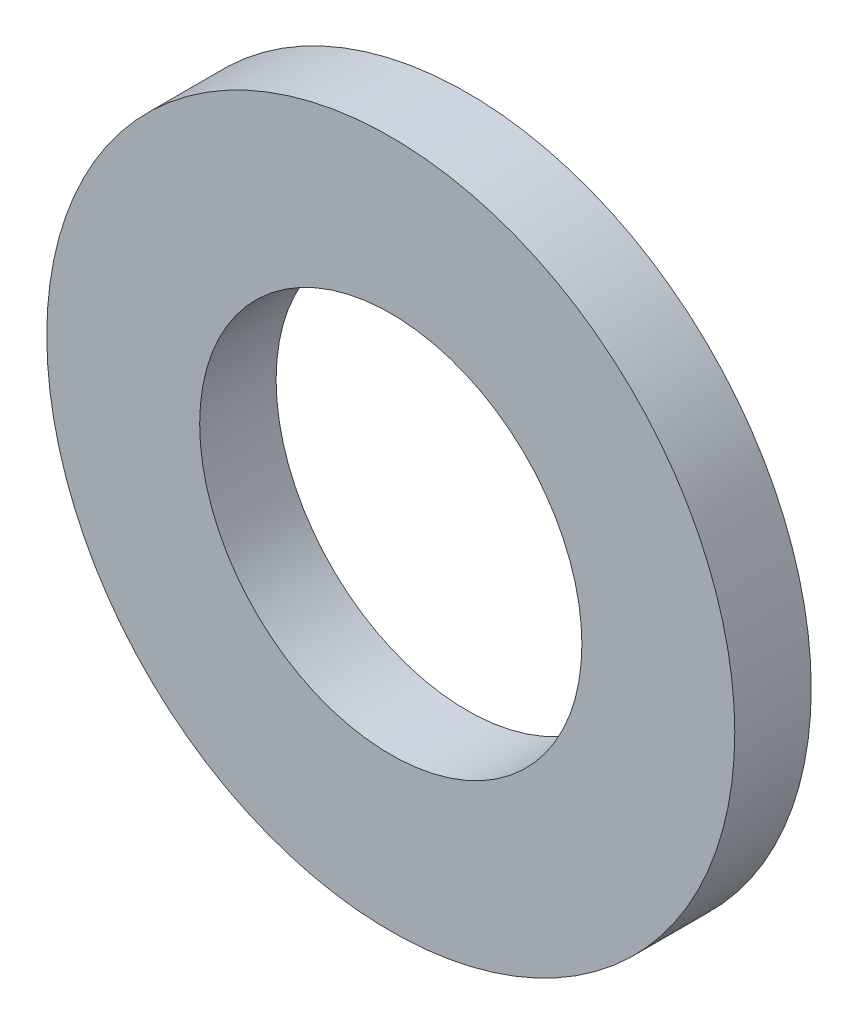
ISO-10303-21;
HEADER;
FILE_DESCRIPTION(('STEP AP214'),'2;1');
FILE_NAME('part.step','',(''),(''),'','','');
FILE_SCHEMA(('AUTOMOTIVE_DESIGN { 1 0 10303 214 1 1 1 1 }'));
ENDSEC;
DATA;
#1=APPLICATION_CONTEXT('core data for automotive mechanical design processes');
#2=APPLICATION_PROTOCOL_DEFINITION('international standard','automotive_design',2000,#1);
#3=PRODUCT_CONTEXT('',#1,'mechanical');
#4=PRODUCT('Part','Part','',(#3));
#5=PRODUCT_RELATED_PRODUCT_CATEGORY('part','',(#4));
#6=PRODUCT_DEFINITION_FORMATION('','',#4);
#7=PRODUCT_DEFINITION_CONTEXT('part definition',#1,'design');
#8=PRODUCT_DEFINITION('design','',#6,#7);
#9=PRODUCT_DEFINITION_SHAPE('','',#8);
#10=(LENGTH_UNIT() NAMED_UNIT(*) SI_UNIT(.MILLI.,.METRE.));
#11=(NAMED_UNIT(*) PLANE_ANGLE_UNIT() SI_UNIT($,.RADIAN.));
#12=(NAMED_UNIT(*) SI_UNIT($,.STERADIAN.) SOLID_ANGLE_UNIT());
#13=UNCERTAINTY_MEASURE_WITH_UNIT(LENGTH_MEASURE(1.E-05),#10,'distance_accuracy_value','');
#14=(GEOMETRIC_REPRESENTATION_CONTEXT(3) GLOBAL_UNCERTAINTY_ASSIGNED_CONTEXT((#13)) GLOBAL_UNIT_ASSIGNED_CONTEXT((#10,
#11,#12)) REPRESENTATION_CONTEXT('',''));
#15=CARTESIAN_POINT('',(0.,0.,0.));
#16=DIRECTION('',(0.,0.,1.));
#17=DIRECTION('',(1.,0.,0.));
#18=AXIS2_PLACEMENT_3D('',#15,#16,#17);
#19=CARTESIAN_POINT('',(0.,0.,1.));
#20=DIRECTION('',(0.,0.,1.));
#21=DIRECTION('',(1.,0.,0.));
#22=AXIS2_PLACEMENT_3D('',#19,#20,#21);
#23=PLANE('',#22);
#24=CARTESIAN_POINT('',(0.,0.,1.));
#25=DIRECTION('',(0.,0.,1.));
#26=DIRECTION('',(1.,0.,0.));
#27=AXIS2_PLACEMENT_3D('',#24,#25,#26);
#28=CIRCLE('',#27,4.5);
#29=CARTESIAN_POINT('',(4.5,0.,1.));
#30=VERTEX_POINT('',#29);
#31=EDGE_CURVE('E10',#30,#30,#28,.T.);
#32=ORIENTED_EDGE('',*,*,#31,.T.);
#33=EDGE_LOOP('',(#32));
#34=FACE_BOUND('',#33,.T.);
#35=CARTESIAN_POINT('',(0.,0.,1.));
#36=DIRECTION('',(0.,0.,1.));
#37=DIRECTION('',(1.,0.,0.));
#38=AXIS2_PLACEMENT_3D('',#35,#36,#37);
#39=CIRCLE('',#38,2.5);
#40=CARTESIAN_POINT('',(2.5,0.,1.));
#41=VERTEX_POINT('',#40);
#42=EDGE_CURVE('E44',#41,#41,#39,.T.);
#43=ORIENTED_EDGE('',*,*,#42,.F.);
#44=EDGE_LOOP('',(#43));
#45=FACE_BOUND('',#44,.T.);
#46=ADVANCED_FACE('F33',(#34,#45),#23,.T.);
#47=CARTESIAN_POINT('',(0.,0.,0.));
#48=DIRECTION('',(0.,0.,1.));
#49=DIRECTION('',(1.,0.,0.));
#50=AXIS2_PLACEMENT_3D('',#47,#48,#49);
#51=PLANE('',#50);
#52=CARTESIAN_POINT('',(0.,0.,0.));
#53=DIRECTION('',(0.,0.,1.));
#54=DIRECTION('',(1.,0.,0.));
#55=AXIS2_PLACEMENT_3D('',#52,#53,#54);
#56=CIRCLE('',#55,4.5);
#57=CARTESIAN_POINT('',(4.5,0.,0.));
#58=VERTEX_POINT('',#57);
#59=EDGE_CURVE('E37',#58,#58,#56,.T.);
#60=ORIENTED_EDGE('',*,*,#59,.F.);
#61=EDGE_LOOP('',(#60));
#62=FACE_BOUND('',#61,.T.);
#63=CARTESIAN_POINT('',(0.,0.,0.));
#64=DIRECTION('',(0.,0.,1.));
#65=DIRECTION('',(1.,0.,0.));
#66=AXIS2_PLACEMENT_3D('',#63,#64,#65);
#67=CIRCLE('',#66,2.5);
#68=CARTESIAN_POINT('',(2.5,0.,0.));
#69=VERTEX_POINT('',#68);
#70=EDGE_CURVE('E46',#69,#69,#67,.T.);
#71=ORIENTED_EDGE('',*,*,#70,.T.);
#72=EDGE_LOOP('',(#71));
#73=FACE_BOUND('',#72,.T.);
#74=ADVANCED_FACE('F56',(#62,#73),#51,.F.);
#75=CARTESIAN_POINT('',(0.,0.,1.));
#76=DIRECTION('',(0.,0.,-1.));
#77=DIRECTION('',(-1.,0.,0.));
#78=AXIS2_PLACEMENT_3D('',#75,#76,#77);
#79=CYLINDRICAL_SURFACE('',#78,4.5);
#80=ORIENTED_EDGE('',*,*,#31,.F.);
#81=EDGE_LOOP('',(#80));
#82=FACE_BOUND('',#81,.T.);
#83=ORIENTED_EDGE('',*,*,#59,.T.);
#84=EDGE_LOOP('',(#83));
#85=FACE_BOUND('',#84,.T.);
#86=ADVANCED_FACE('F35',(#82,#85),#79,.T.);
#87=CARTESIAN_POINT('',(0.,0.,1.));
#88=DIRECTION('',(0.,0.,-1.));
#89=DIRECTION('',(-1.,0.,0.));
#90=AXIS2_PLACEMENT_3D('',#87,#88,#89);
#91=CYLINDRICAL_SURFACE('',#90,2.5);
#92=ORIENTED_EDGE('',*,*,#42,.T.);
#93=EDGE_LOOP('',(#92));
#94=FACE_BOUND('',#93,.T.);
#95=ORIENTED_EDGE('',*,*,#70,.F.);
#96=EDGE_LOOP('',(#95));
#97=FACE_BOUND('',#96,.T.);
#98=ADVANCED_FACE('F52',(#94,#97),#91,.F.);
#99=CLOSED_SHELL('',(#46,#74,#86,#98));
#100=MANIFOLD_SOLID_BREP('B2',#99);
#101=ADVANCED_BREP_SHAPE_REPRESENTATION('',(#18,#100),#14);
#102=SHAPE_DEFINITION_REPRESENTATION(#9,#101);
ENDSEC;
END-ISO-10303-21;
